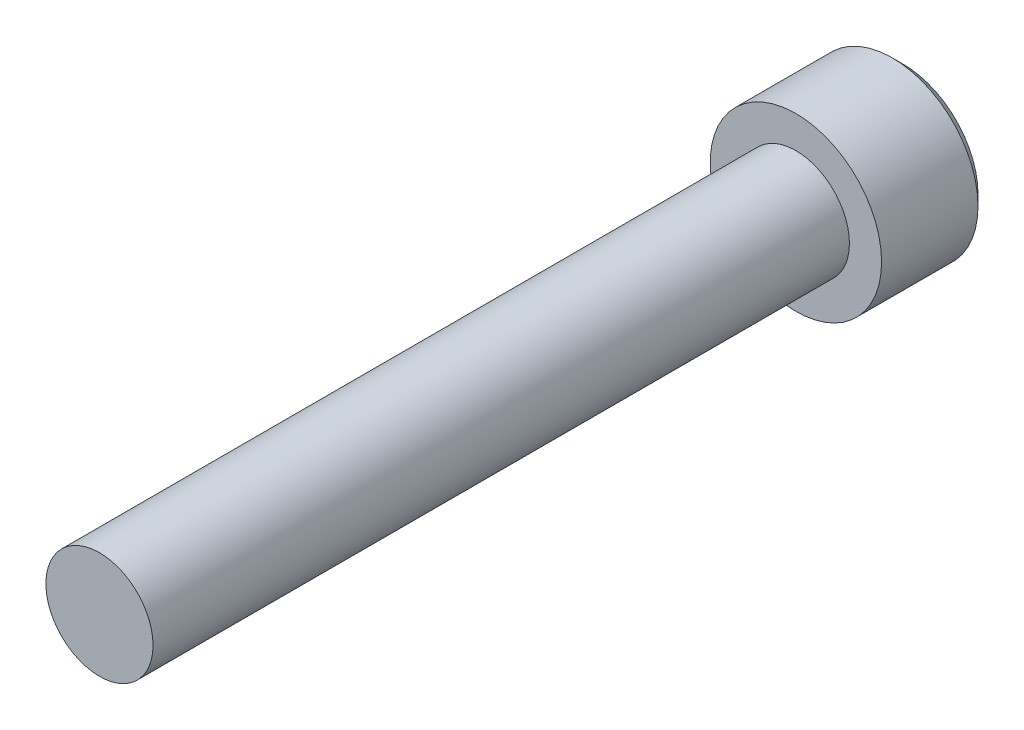
ISO-10303-21;
HEADER;
FILE_DESCRIPTION(('STEP AP214'),'2;1');
FILE_NAME('part.step','',(''),(''),'','','');
FILE_SCHEMA(('AUTOMOTIVE_DESIGN { 1 0 10303 214 1 1 1 1 }'));
ENDSEC;
DATA;
#1=APPLICATION_CONTEXT('core data for automotive mechanical design processes');
#2=APPLICATION_PROTOCOL_DEFINITION('international standard','automotive_design',2000,#1);
#3=PRODUCT_CONTEXT('',#1,'mechanical');
#4=PRODUCT('Part','Part','',(#3));
#5=PRODUCT_RELATED_PRODUCT_CATEGORY('part','',(#4));
#6=PRODUCT_DEFINITION_FORMATION('','',#4);
#7=PRODUCT_DEFINITION_CONTEXT('part definition',#1,'design');
#8=PRODUCT_DEFINITION('design','',#6,#7);
#9=PRODUCT_DEFINITION_SHAPE('','',#8);
#10=(LENGTH_UNIT() NAMED_UNIT(*) SI_UNIT(.MILLI.,.METRE.));
#11=(NAMED_UNIT(*) PLANE_ANGLE_UNIT() SI_UNIT($,.RADIAN.));
#12=(NAMED_UNIT(*) SI_UNIT($,.STERADIAN.) SOLID_ANGLE_UNIT());
#13=UNCERTAINTY_MEASURE_WITH_UNIT(LENGTH_MEASURE(1.E-05),#10,'distance_accuracy_value','');
#14=(GEOMETRIC_REPRESENTATION_CONTEXT(3) GLOBAL_UNCERTAINTY_ASSIGNED_CONTEXT((#13)) GLOBAL_UNIT_ASSIGNED_CONTEXT((#10,
#11,#12)) REPRESENTATION_CONTEXT('',''));
#15=CARTESIAN_POINT('',(0.,0.,0.));
#16=DIRECTION('',(0.,0.,1.));
#17=DIRECTION('',(1.,0.,0.));
#18=AXIS2_PLACEMENT_3D('',#15,#16,#17);
#19=CARTESIAN_POINT('',(0.,0.,65.));
#20=DIRECTION('',(0.,0.,-1.));
#21=DIRECTION('',(-1.,0.,0.));
#22=AXIS2_PLACEMENT_3D('',#19,#20,#21);
#23=CYLINDRICAL_SURFACE('',#22,5.);
#24=CARTESIAN_POINT('',(0.,0.,65.));
#25=DIRECTION('',(0.,0.,1.));
#26=DIRECTION('',(1.,0.,0.));
#27=AXIS2_PLACEMENT_3D('',#24,#25,#26);
#28=CIRCLE('',#27,5.);
#29=CARTESIAN_POINT('',(5.,0.,65.));
#30=VERTEX_POINT('',#29);
#31=EDGE_CURVE('E60',#30,#30,#28,.T.);
#32=ORIENTED_EDGE('',*,*,#31,.F.);
#33=EDGE_LOOP('',(#32));
#34=FACE_BOUND('',#33,.T.);
#35=CARTESIAN_POINT('',(0.,0.,0.));
#36=DIRECTION('',(0.,0.,1.));
#37=DIRECTION('',(1.,0.,0.));
#38=AXIS2_PLACEMENT_3D('',#35,#36,#37);
#39=CIRCLE('',#38,5.);
#40=CARTESIAN_POINT('',(5.,0.,0.));
#41=VERTEX_POINT('',#40);
#42=EDGE_CURVE('E65',#41,#41,#39,.T.);
#43=ORIENTED_EDGE('',*,*,#42,.T.);
#44=EDGE_LOOP('',(#43));
#45=FACE_BOUND('',#44,.T.);
#46=ADVANCED_FACE('F46',(#34,#45),#23,.T.);
#47=CARTESIAN_POINT('',(0.,0.,65.));
#48=DIRECTION('',(0.,0.,1.));
#49=DIRECTION('',(1.,0.,0.));
#50=AXIS2_PLACEMENT_3D('',#47,#48,#49);
#51=PLANE('',#50);
#52=ORIENTED_EDGE('',*,*,#31,.T.);
#53=EDGE_LOOP('',(#52));
#54=FACE_BOUND('',#53,.T.);
#55=ADVANCED_FACE('F81',(#54),#51,.T.);
#56=CARTESIAN_POINT('',(0.,0.,-10.));
#57=DIRECTION('',(0.,0.,1.));
#58=DIRECTION('',(1.,0.,0.));
#59=AXIS2_PLACEMENT_3D('',#56,#57,#58);
#60=CYLINDRICAL_SURFACE('',#59,8.);
#61=CARTESIAN_POINT('',(0.,0.,-8.99999999999999));
#62=DIRECTION('',(0.,0.,1.));
#63=DIRECTION('',(1.,0.,0.));
#64=AXIS2_PLACEMENT_3D('',#61,#62,#63);
#65=CIRCLE('',#64,8.);
#66=CARTESIAN_POINT('',(8.,0.,-8.99999999999999));
#67=VERTEX_POINT('',#66);
#68=EDGE_CURVE('E55',#67,#67,#65,.T.);
#69=ORIENTED_EDGE('',*,*,#68,.T.);
#70=EDGE_LOOP('',(#69));
#71=FACE_BOUND('',#70,.T.);
#72=CARTESIAN_POINT('',(0.,0.,0.));
#73=DIRECTION('',(0.,0.,1.));
#74=DIRECTION('',(1.,0.,0.));
#75=AXIS2_PLACEMENT_3D('',#72,#73,#74);
#76=CIRCLE('',#75,8.);
#77=CARTESIAN_POINT('',(8.,0.,0.));
#78=VERTEX_POINT('',#77);
#79=EDGE_CURVE('E70',#78,#78,#76,.T.);
#80=ORIENTED_EDGE('',*,*,#79,.F.);
#81=EDGE_LOOP('',(#80));
#82=FACE_BOUND('',#81,.T.);
#83=ADVANCED_FACE('F78',(#71,#82),#60,.T.);
#84=CARTESIAN_POINT('',(0.,0.,-10.));
#85=DIRECTION('',(0.,0.,1.));
#86=DIRECTION('',(1.,0.,0.));
#87=AXIS2_PLACEMENT_3D('',#84,#85,#86);
#88=PLANE('',#87);
#89=CARTESIAN_POINT('',(0.,0.,-10.));
#90=DIRECTION('',(0.,0.,1.));
#91=DIRECTION('',(1.,0.,0.));
#92=AXIS2_PLACEMENT_3D('',#89,#90,#91);
#93=CIRCLE('',#92,6.99999999999999);
#94=CARTESIAN_POINT('',(6.99999999999999,0.,-10.));
#95=VERTEX_POINT('',#94);
#96=EDGE_CURVE('E10',#95,#95,#93,.F.);
#97=ORIENTED_EDGE('',*,*,#96,.T.);
#98=EDGE_LOOP('',(#97));
#99=FACE_BOUND('',#98,.T.);
#100=ADVANCED_FACE('F80',(#99),#88,.F.);
#101=CARTESIAN_POINT('',(0.,0.,0.));
#102=DIRECTION('',(0.,0.,1.));
#103=DIRECTION('',(1.,0.,0.));
#104=AXIS2_PLACEMENT_3D('',#101,#102,#103);
#105=PLANE('',#104);
#106=ORIENTED_EDGE('',*,*,#42,.F.);
#107=EDGE_LOOP('',(#106));
#108=FACE_BOUND('',#107,.T.);
#109=ORIENTED_EDGE('',*,*,#79,.T.);
#110=EDGE_LOOP('',(#109));
#111=FACE_BOUND('',#110,.T.);
#112=ADVANCED_FACE('F76',(#108,#111),#105,.T.);
#113=CARTESIAN_POINT('',(0.,0.,-8.99999999999999));
#114=DIRECTION('',(0.,0.,1.));
#115=DIRECTION('',(1.,0.,0.));
#116=AXIS2_PLACEMENT_3D('',#113,#114,#115);
#117=CONICAL_SURFACE('',#116,8.,0.785398163397452);
#118=ORIENTED_EDGE('',*,*,#96,.F.);
#119=EDGE_LOOP('',(#118));
#120=FACE_BOUND('',#119,.T.);
#121=ORIENTED_EDGE('',*,*,#68,.F.);
#122=EDGE_LOOP('',(#121));
#123=FACE_BOUND('',#122,.T.);
#124=ADVANCED_FACE('F49',(#120,#123),#117,.T.);
#125=CLOSED_SHELL('',(#46,#55,#83,#100,#112,#124));
#126=MANIFOLD_SOLID_BREP('B2',#125);
#127=ADVANCED_BREP_SHAPE_REPRESENTATION('',(#18,#126),#14);
#128=SHAPE_DEFINITION_REPRESENTATION(#9,#127);
ENDSEC;
END-ISO-10303-21;
